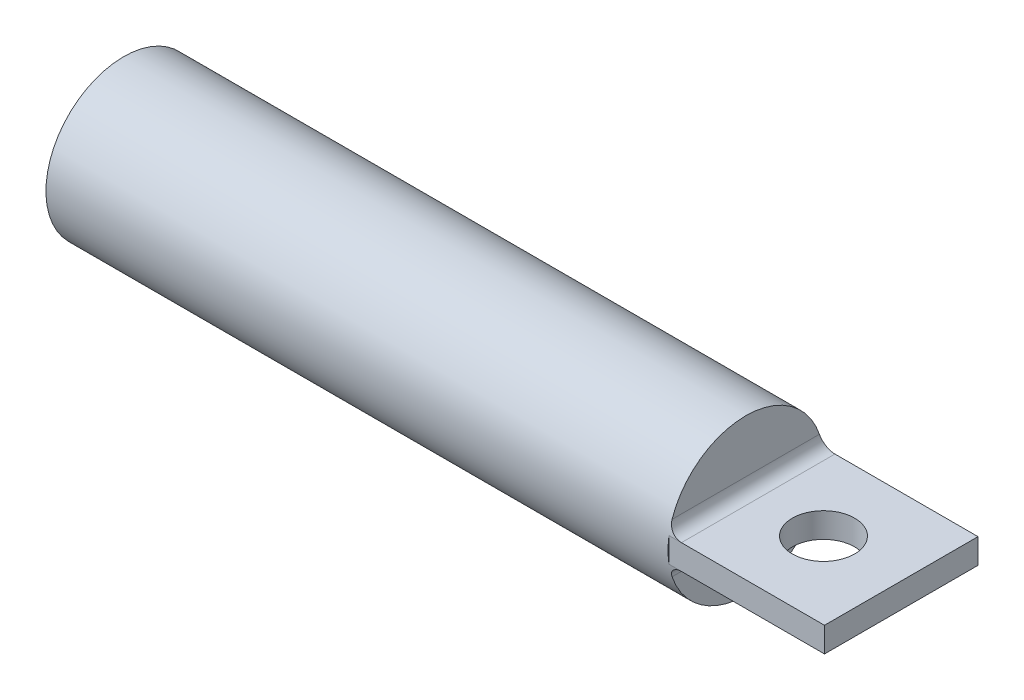
ISO-10303-21;
HEADER;
FILE_DESCRIPTION(('STEP AP214'),'2;1');
FILE_NAME('part.step','',(''),(''),'','','');
FILE_SCHEMA(('AUTOMOTIVE_DESIGN { 1 0 10303 214 1 1 1 1 }'));
ENDSEC;
DATA;
#1=APPLICATION_CONTEXT('core data for automotive mechanical design processes');
#2=APPLICATION_PROTOCOL_DEFINITION('international standard','automotive_design',2000,#1);
#3=PRODUCT_CONTEXT('',#1,'mechanical');
#4=PRODUCT('Part','Part','',(#3));
#5=PRODUCT_RELATED_PRODUCT_CATEGORY('part','',(#4));
#6=PRODUCT_DEFINITION_FORMATION('','',#4);
#7=PRODUCT_DEFINITION_CONTEXT('part definition',#1,'design');
#8=PRODUCT_DEFINITION('design','',#6,#7);
#9=PRODUCT_DEFINITION_SHAPE('','',#8);
#10=(LENGTH_UNIT() NAMED_UNIT(*) SI_UNIT(.MILLI.,.METRE.));
#11=(NAMED_UNIT(*) PLANE_ANGLE_UNIT() SI_UNIT($,.RADIAN.));
#12=(NAMED_UNIT(*) SI_UNIT($,.STERADIAN.) SOLID_ANGLE_UNIT());
#13=UNCERTAINTY_MEASURE_WITH_UNIT(LENGTH_MEASURE(1.E-05),#10,'distance_accuracy_value','');
#14=(GEOMETRIC_REPRESENTATION_CONTEXT(3) GLOBAL_UNCERTAINTY_ASSIGNED_CONTEXT((#13)) GLOBAL_UNIT_ASSIGNED_CONTEXT((#10,
#11,#12)) REPRESENTATION_CONTEXT('',''));
#15=CARTESIAN_POINT('',(0.,0.,0.));
#16=DIRECTION('',(0.,0.,1.));
#17=DIRECTION('',(1.,0.,0.));
#18=AXIS2_PLACEMENT_3D('',#15,#16,#17);
#19=CARTESIAN_POINT('',(25.4,0.,0.));
#20=DIRECTION('',(1.,0.,0.));
#21=DIRECTION('',(0.,0.,-1.));
#22=AXIS2_PLACEMENT_3D('',#19,#20,#21);
#23=PLANE('',#22);
#24=DIRECTION('',(0.,-1.,0.));
#25=VECTOR('',#24,1.);
#26=CARTESIAN_POINT('',(25.4,-0.508,3.13409652053028));
#27=LINE('',#26,#25);
#28=CARTESIAN_POINT('',(25.4,0.508,3.13409652053028));
#29=VERTEX_POINT('',#28);
#30=CARTESIAN_POINT('',(25.4,-0.508,3.13409652053028));
#31=VERTEX_POINT('',#30);
#32=EDGE_CURVE('E206',#29,#31,#27,.T.);
#33=ORIENTED_EDGE('',*,*,#32,.F.);
#34=CARTESIAN_POINT('',(25.4,0.,0.));
#35=DIRECTION('',(1.,0.,0.));
#36=DIRECTION('',(0.,0.,-1.));
#37=AXIS2_PLACEMENT_3D('',#34,#35,#36);
#38=CIRCLE('',#37,3.175);
#39=EDGE_CURVE('E139',#29,#31,#38,.T.);
#40=ORIENTED_EDGE('',*,*,#39,.T.);
#41=EDGE_LOOP('',(#33,#40));
#42=FACE_BOUND('',#41,.T.);
#43=ADVANCED_FACE('F32',(#42),#23,.T.);
#44=CARTESIAN_POINT('',(25.4,1.016,-3.00805069771106));
#45=VERTEX_POINT('',#44);
#46=CARTESIAN_POINT('',(25.4,1.016,3.00805069771106));
#47=VERTEX_POINT('',#46);
#48=EDGE_CURVE('E140',#45,#47,#38,.T.);
#49=ORIENTED_EDGE('',*,*,#48,.T.);
#50=DIRECTION('',(0.,0.,1.));
#51=VECTOR('',#50,1.);
#52=CARTESIAN_POINT('',(25.4,1.016,0.));
#53=LINE('',#52,#51);
#54=EDGE_CURVE('E144',#47,#45,#53,.F.);
#55=ORIENTED_EDGE('',*,*,#54,.T.);
#56=EDGE_LOOP('',(#49,#55));
#57=FACE_BOUND('',#56,.T.);
#58=ADVANCED_FACE('F177',(#57),#23,.T.);
#59=DIRECTION('',(0.,1.,0.));
#60=VECTOR('',#59,1.);
#61=CARTESIAN_POINT('',(25.4,0.508,-3.13409652053028));
#62=LINE('',#61,#60);
#63=CARTESIAN_POINT('',(25.4,-0.508,-3.13409652053028));
#64=VERTEX_POINT('',#63);
#65=CARTESIAN_POINT('',(25.4,0.507999999999998,-3.13409652053028));
#66=VERTEX_POINT('',#65);
#67=EDGE_CURVE('E125',#64,#66,#62,.T.);
#68=ORIENTED_EDGE('',*,*,#67,.F.);
#69=EDGE_CURVE('E132',#64,#66,#38,.T.);
#70=ORIENTED_EDGE('',*,*,#69,.T.);
#71=EDGE_LOOP('',(#68,#70));
#72=FACE_BOUND('',#71,.T.);
#73=ADVANCED_FACE('F184',(#72),#23,.T.);
#74=CARTESIAN_POINT('',(25.4,0.,0.));
#75=DIRECTION('',(-1.,0.,0.));
#76=DIRECTION('',(0.,0.,1.));
#77=AXIS2_PLACEMENT_3D('',#74,#75,#76);
#78=CYLINDRICAL_SURFACE('',#77,3.175);
#79=ORIENTED_EDGE('',*,*,#48,.F.);
#80=CARTESIAN_POINT('',(25.4,1.016,-3.00805069771106));
#81=CARTESIAN_POINT('',(25.3999744032918,0.987517611628772,-3.01768849137824));
#82=CARTESIAN_POINT('',(25.4023951827937,0.958870654897861,-3.02689635971706));
#83=CARTESIAN_POINT('',(25.4121086085714,0.902069906468568,-3.04429793559751));
#84=CARTESIAN_POINT('',(25.4194061484062,0.873916639310065,-3.05249061465447));
#85=CARTESIAN_POINT('',(25.4388700534012,0.818935702852947,-3.06770145579501));
#86=CARTESIAN_POINT('',(25.451045353065,0.79211056813882,-3.07471742888801));
#87=CARTESIAN_POINT('',(25.4800040907193,0.740771694786242,-3.08748769418232));
#88=CARTESIAN_POINT('',(25.496783308182,0.716255866665418,-3.09324313329916));
#89=CARTESIAN_POINT('',(25.5338505431638,0.671184534607392,-3.10332928018853));
#90=CARTESIAN_POINT('',(25.5539945215507,0.650520127676837,-3.10770295057255));
#91=CARTESIAN_POINT('',(25.5976203458093,0.612813237566845,-3.11535809755968));
#92=CARTESIAN_POINT('',(25.6211030635868,0.595771703403957,-3.11863928811333));
#93=CARTESIAN_POINT('',(25.6701275331566,0.566243525622576,-3.1241341891762));
#94=CARTESIAN_POINT('',(25.6956082947026,0.553659687550104,-3.12637106778662));
#95=CARTESIAN_POINT('',(25.7483556405558,0.532906460484515,-3.12997563122692));
#96=CARTESIAN_POINT('',(25.7756208449149,0.524733704496133,-3.13134397915031));
#97=CARTESIAN_POINT('',(25.8205672120332,0.51527134744563,-3.1329113598045));
#98=CARTESIAN_POINT('',(25.8379510098739,0.512546160833053,-3.13335716841764));
#99=CARTESIAN_POINT('',(25.872886148487,0.508911026280369,-3.13394889056829));
#100=CARTESIAN_POINT('',(25.890437200448,0.507998374918635,-3.13409525074719));
#101=CARTESIAN_POINT('',(25.9079965036789,0.508000000012032,-3.13409652052833));
#102=B_SPLINE_CURVE_WITH_KNOTS('',3,(#80,#81,#82,#83,#84,#85,#86,#87,#88,#89,#90,#91,#92,#93,
#94,#95,#96,#97,#98,#99,#100,#101),.UNSPECIFIED.,.F.,.F.,(4,2,2,2,2,2,2,2,2,2,4),(0.,
0.0901333124127537,0.180357204693476,0.270747119587447,0.361054447026895,0.448187978324593,
0.535344306323793,0.620462538288279,0.705515706975862,0.758231839271423,0.810869285492851),.UNSPECIFIED.);
#103=CARTESIAN_POINT('',(25.908,0.508,-3.13409652053028));
#104=VERTEX_POINT('',#103);
#105=EDGE_CURVE('E155',#45,#104,#102,.T.);
#106=ORIENTED_EDGE('',*,*,#105,.T.);
#107=DIRECTION('',(-1.,0.,0.));
#108=VECTOR('',#107,1.);
#109=CARTESIAN_POINT('',(25.4,0.507999999999998,-3.13409652053028));
#110=LINE('',#109,#108);
#111=EDGE_CURVE('E311',#66,#104,#110,.F.);
#112=ORIENTED_EDGE('',*,*,#111,.F.);
#113=ORIENTED_EDGE('',*,*,#69,.F.);
#114=DIRECTION('',(-1.,0.,0.));
#115=VECTOR('',#114,1.);
#116=CARTESIAN_POINT('',(25.4,-0.508,-3.13409652053028));
#117=LINE('',#116,#115);
#118=CARTESIAN_POINT('',(25.9079965038714,-0.507999999999997,-3.13409652053028));
#119=VERTEX_POINT('',#118);
#120=EDGE_CURVE('E41',#64,#119,#117,.F.);
#121=ORIENTED_EDGE('',*,*,#120,.T.);
#122=CARTESIAN_POINT('',(25.9079965038714,-0.507999999999997,-3.13409652053028));
#123=CARTESIAN_POINT('',(25.8797717031895,-0.507974419566321,-3.13408980025937));
#124=CARTESIAN_POINT('',(25.8515542488646,-0.510351108507427,-3.13371525337494));
#125=CARTESIAN_POINT('',(25.7959428188716,-0.519719365469269,-3.13218091450152));
#126=CARTESIAN_POINT('',(25.7685481326827,-0.526706824508829,-3.13102182165288));
#127=CARTESIAN_POINT('',(25.7153252029894,-0.545112004671271,-3.12786820710254));
#128=CARTESIAN_POINT('',(25.6894977191587,-0.556531854791061,-3.12587328389234));
#129=CARTESIAN_POINT('',(25.6401560091234,-0.583434903581319,-3.12096398037492));
#130=CARTESIAN_POINT('',(25.6166414146108,-0.598917453856238,-3.11804974677207));
#131=CARTESIAN_POINT('',(25.5725477431488,-0.633480039027652,-3.11121155909454));
#132=CARTESIAN_POINT('',(25.551972118195,-0.652564244222185,-3.10728643258269));
#133=CARTESIAN_POINT('',(25.5143352918812,-0.693712035454519,-3.09835939832883));
#134=CARTESIAN_POINT('',(25.4972742375737,-0.715775746093362,-3.09335744554942));
#135=CARTESIAN_POINT('',(25.466936307634,-0.762409485170083,-3.08219665575005));
#136=CARTESIAN_POINT('',(25.4536969339139,-0.787001338703983,-3.07602727653712));
#137=CARTESIAN_POINT('',(25.4314867910381,-0.837767692007906,-3.06259028762071));
#138=CARTESIAN_POINT('',(25.4225167622564,-0.863942465395648,-3.0553224877209));
#139=CARTESIAN_POINT('',(25.4104741285285,-0.911180084112772,-3.04151916363413));
#140=CARTESIAN_POINT('',(25.4065336136515,-0.932085184616533,-3.03518025462755));
#141=CARTESIAN_POINT('',(25.4012966085683,-0.974019233664649,-3.02198623818588));
#142=CARTESIAN_POINT('',(25.3999950531123,-0.995047867103927,-3.0151321458875));
#143=CARTESIAN_POINT('',(25.4,-1.016,-3.00805069771106));
#144=B_SPLINE_CURVE_WITH_KNOTS('',3,(#122,#123,#124,#125,#126,#127,#128,#129,#130,#131,#132,
#133,#134,#135,#136,#137,#138,#139,#140,#141,#142,#143),.UNSPECIFIED.,.F.,.F.,(4,2,2,2,2,2,2,2,
2,2,4),(0.,0.0845615157500869,0.169047774383328,0.253574664364937,0.338088072288241,
0.42269994406877,0.507315355360927,0.592734869570084,0.678169191522528,0.744603086856162,
0.810909347015586),.UNSPECIFIED.);
#145=CARTESIAN_POINT('',(25.4,-1.016,-3.00805069771106));
#146=VERTEX_POINT('',#145);
#147=EDGE_CURVE('E70',#119,#146,#144,.T.);
#148=ORIENTED_EDGE('',*,*,#147,.T.);
#149=CARTESIAN_POINT('',(25.4,-1.016,3.00805069771106));
#150=VERTEX_POINT('',#149);
#151=EDGE_CURVE('E137',#150,#146,#38,.T.);
#152=ORIENTED_EDGE('',*,*,#151,.F.);
#153=CARTESIAN_POINT('',(25.4,-1.016,3.00805069771106));
#154=CARTESIAN_POINT('',(25.3999744032918,-0.98751761162877,3.01768849137824));
#155=CARTESIAN_POINT('',(25.4023951827937,-0.958870654897857,3.02689635971706));
#156=CARTESIAN_POINT('',(25.4121086085714,-0.902069906468563,3.04429793559751));
#157=CARTESIAN_POINT('',(25.4194061484062,-0.873916639310063,3.05249061465447));
#158=CARTESIAN_POINT('',(25.4388700534012,-0.81893570285295,3.06770145579501));
#159=CARTESIAN_POINT('',(25.451045353065,-0.792110568138828,3.07471742888801));
#160=CARTESIAN_POINT('',(25.4800040907193,-0.740771694786249,3.08748769418231));
#161=CARTESIAN_POINT('',(25.496783308182,-0.716255866665422,3.09324313329916));
#162=CARTESIAN_POINT('',(25.5338505431638,-0.671184534607383,3.10332928018854));
#163=CARTESIAN_POINT('',(25.5539945215507,-0.65052012767682,3.10770295057255));
#164=CARTESIAN_POINT('',(25.5976203458094,-0.612813237566831,3.11535809755969));
#165=CARTESIAN_POINT('',(25.6211030635868,-0.59577170340395,3.11863928811333));
#166=CARTESIAN_POINT('',(25.6701275331566,-0.566243525622597,3.12413418917619));
#167=CARTESIAN_POINT('',(25.6956082947025,-0.553659687550139,3.12637106778661));
#168=CARTESIAN_POINT('',(25.7483556405557,-0.53290646048454,3.12997563122691));
#169=CARTESIAN_POINT('',(25.7756208449149,-0.524733704496144,3.13134397915031));
#170=CARTESIAN_POINT('',(25.8205672120651,-0.515271347438938,3.13291135980561));
#171=CARTESIAN_POINT('',(25.8379510099382,-0.512546160822976,3.13335716841929));
#172=CARTESIAN_POINT('',(25.8728861486167,-0.508911026270254,3.13394889056993));
#173=CARTESIAN_POINT('',(25.8904372006106,-0.507998374911863,3.13409525074828));
#174=CARTESIAN_POINT('',(25.907996503874,-0.50800000001203,3.13409652052833));
#175=B_SPLINE_CURVE_WITH_KNOTS('',3,(#153,#154,#155,#156,#157,#158,#159,#160,#161,#162,#163,
#164,#165,#166,#167,#168,#169,#170,#171,#172,#173,#174),.UNSPECIFIED.,.F.,.F.,(4,2,2,2,2,2,2,2,
2,2,4),(0.,0.0901333124127614,0.180357204693476,0.270747119587433,0.361054447026895,
0.448187978324629,0.535344306323793,0.620462538288155,0.705515706975862,0.758231839368831,
0.810869285687713),.UNSPECIFIED.);
#176=CARTESIAN_POINT('',(25.908,-0.508,3.13409652053028));
#177=VERTEX_POINT('',#176);
#178=EDGE_CURVE('E318',#150,#177,#175,.T.);
#179=ORIENTED_EDGE('',*,*,#178,.T.);
#180=DIRECTION('',(-1.,0.,0.));
#181=VECTOR('',#180,1.);
#182=CARTESIAN_POINT('',(25.4,-0.508,3.13409652053028));
#183=LINE('',#182,#181);
#184=EDGE_CURVE('E11',#31,#177,#183,.F.);
#185=ORIENTED_EDGE('',*,*,#184,.F.);
#186=ORIENTED_EDGE('',*,*,#39,.F.);
#187=DIRECTION('',(-1.,0.,0.));
#188=VECTOR('',#187,1.);
#189=CARTESIAN_POINT('',(25.4,0.508,3.13409652053028));
#190=LINE('',#189,#188);
#191=CARTESIAN_POINT('',(25.9079965038714,0.507999999999997,3.13409652053028));
#192=VERTEX_POINT('',#191);
#193=EDGE_CURVE('E315',#29,#192,#190,.F.);
#194=ORIENTED_EDGE('',*,*,#193,.T.);
#195=CARTESIAN_POINT('',(25.9079965038714,0.507999999999997,3.13409652053028));
#196=CARTESIAN_POINT('',(25.8797717031895,0.507974419566321,3.13408980025937));
#197=CARTESIAN_POINT('',(25.8515542488646,0.510351108507427,3.13371525337494));
#198=CARTESIAN_POINT('',(25.7959428188716,0.519719365469269,3.13218091450152));
#199=CARTESIAN_POINT('',(25.7685481326827,0.526706824508829,3.13102182165288));
#200=CARTESIAN_POINT('',(25.7153252029894,0.545112004671271,3.12786820710254));
#201=CARTESIAN_POINT('',(25.6894977191587,0.556531854791061,3.12587328389234));
#202=CARTESIAN_POINT('',(25.6401560091234,0.583434903581319,3.12096398037492));
#203=CARTESIAN_POINT('',(25.6166414146108,0.598917453856238,3.11804974677207));
#204=CARTESIAN_POINT('',(25.5725477431488,0.633480039027652,3.11121155909454));
#205=CARTESIAN_POINT('',(25.551972118195,0.652564244222185,3.10728643258269));
#206=CARTESIAN_POINT('',(25.5143352918812,0.693712035454519,3.09835939832883));
#207=CARTESIAN_POINT('',(25.4972742375737,0.715775746093362,3.09335744554942));
#208=CARTESIAN_POINT('',(25.466936307634,0.762409485170083,3.08219665575005));
#209=CARTESIAN_POINT('',(25.4536969339139,0.787001338703983,3.07602727653712));
#210=CARTESIAN_POINT('',(25.4314867910381,0.837767692007906,3.06259028762071));
#211=CARTESIAN_POINT('',(25.4225167622564,0.863942465395648,3.0553224877209));
#212=CARTESIAN_POINT('',(25.4104741285285,0.911180084112772,3.04151916363413));
#213=CARTESIAN_POINT('',(25.4065336136515,0.932085184616533,3.03518025462755));
#214=CARTESIAN_POINT('',(25.4012966085683,0.974019233664649,3.02198623818588));
#215=CARTESIAN_POINT('',(25.3999950531123,0.995047867103927,3.0151321458875));
#216=CARTESIAN_POINT('',(25.4,1.016,3.00805069771106));
#217=B_SPLINE_CURVE_WITH_KNOTS('',3,(#195,#196,#197,#198,#199,#200,#201,#202,#203,#204,#205,
#206,#207,#208,#209,#210,#211,#212,#213,#214,#215,#216),.UNSPECIFIED.,.F.,.F.,(4,2,2,2,2,2,2,2,
2,2,4),(0.,0.0845615157500869,0.169047774383328,0.253574664364937,0.338088072288241,
0.42269994406877,0.507315355360927,0.592734869570084,0.678169191522528,0.744603086856162,
0.810909347015586),.UNSPECIFIED.);
#218=EDGE_CURVE('E81',#192,#47,#217,.T.);
#219=ORIENTED_EDGE('',*,*,#218,.T.);
#220=EDGE_LOOP('',(#79,#106,#112,#113,#121,#148,#152,#179,#185,#186,#194,#219));
#221=FACE_BOUND('',#220,.T.);
#222=CARTESIAN_POINT('',(0.,0.,0.));
#223=DIRECTION('',(1.,0.,0.));
#224=DIRECTION('',(0.,0.,-1.));
#225=AXIS2_PLACEMENT_3D('',#222,#223,#224);
#226=CIRCLE('',#225,3.175);
#227=CARTESIAN_POINT('',(0.,0.,-3.175));
#228=VERTEX_POINT('',#227);
#229=EDGE_CURVE('E129',#228,#228,#226,.T.);
#230=ORIENTED_EDGE('',*,*,#229,.T.);
#231=EDGE_LOOP('',(#230));
#232=FACE_BOUND('',#231,.T.);
#233=ADVANCED_FACE('F160',(#221,#232),#78,.T.);
#234=ORIENTED_EDGE('',*,*,#151,.T.);
#235=DIRECTION('',(0.,0.,-1.));
#236=VECTOR('',#235,1.);
#237=CARTESIAN_POINT('',(25.4,-1.016,0.));
#238=LINE('',#237,#236);
#239=EDGE_CURVE('E148',#146,#150,#238,.F.);
#240=ORIENTED_EDGE('',*,*,#239,.T.);
#241=EDGE_LOOP('',(#234,#240));
#242=FACE_BOUND('',#241,.T.);
#243=ADVANCED_FACE('F180',(#242),#23,.T.);
#244=CARTESIAN_POINT('',(0.,0.,0.));
#245=DIRECTION('',(1.,0.,0.));
#246=DIRECTION('',(0.,0.,-1.));
#247=AXIS2_PLACEMENT_3D('',#244,#245,#246);
#248=PLANE('',#247);
#249=ORIENTED_EDGE('',*,*,#229,.F.);
#250=EDGE_LOOP('',(#249));
#251=FACE_BOUND('',#250,.T.);
#252=ADVANCED_FACE('F189',(#251),#248,.F.);
#253=CARTESIAN_POINT('',(31.75,-0.508,3.13409652053028));
#254=DIRECTION('',(0.,0.,-1.));
#255=DIRECTION('',(-1.,0.,0.));
#256=AXIS2_PLACEMENT_3D('',#253,#254,#255);
#257=PLANE('',#256);
#258=ORIENTED_EDGE('',*,*,#32,.T.);
#259=ORIENTED_EDGE('',*,*,#184,.T.);
#260=DIRECTION('',(-1.,0.,0.));
#261=VECTOR('',#260,1.);
#262=CARTESIAN_POINT('',(31.75,-0.508,3.13409652053028));
#263=LINE('',#262,#261);
#264=CARTESIAN_POINT('',(31.75,-0.508,3.13409652053028));
#265=VERTEX_POINT('',#264);
#266=EDGE_CURVE('E48',#265,#177,#263,.T.);
#267=ORIENTED_EDGE('',*,*,#266,.F.);
#268=DIRECTION('',(0.,-1.,0.));
#269=VECTOR('',#268,1.);
#270=CARTESIAN_POINT('',(31.75,-0.508,3.13409652053028));
#271=LINE('',#270,#269);
#272=CARTESIAN_POINT('',(31.75,0.508,3.13409652053028));
#273=VERTEX_POINT('',#272);
#274=EDGE_CURVE('E117',#273,#265,#271,.T.);
#275=ORIENTED_EDGE('',*,*,#274,.F.);
#276=DIRECTION('',(-1.,0.,0.));
#277=VECTOR('',#276,1.);
#278=CARTESIAN_POINT('',(31.75,0.508,3.13409652053028));
#279=LINE('',#278,#277);
#280=EDGE_CURVE('E212',#273,#192,#279,.T.);
#281=ORIENTED_EDGE('',*,*,#280,.T.);
#282=ORIENTED_EDGE('',*,*,#193,.F.);
#283=EDGE_LOOP('',(#258,#259,#267,#275,#281,#282));
#284=FACE_BOUND('',#283,.T.);
#285=ADVANCED_FACE('F128',(#284),#257,.F.);
#286=CARTESIAN_POINT('',(31.75,-0.508,-3.13409652053028));
#287=DIRECTION('',(0.,1.,0.));
#288=DIRECTION('',(0.,0.,1.));
#289=AXIS2_PLACEMENT_3D('',#286,#287,#288);
#290=PLANE('',#289);
#291=CARTESIAN_POINT('',(28.575,-0.508,0.));
#292=DIRECTION('',(0.,1.,0.));
#293=DIRECTION('',(0.,0.,1.));
#294=AXIS2_PLACEMENT_3D('',#291,#292,#293);
#295=CIRCLE('',#294,1.27);
#296=CARTESIAN_POINT('',(28.575,-0.508,1.27));
#297=VERTEX_POINT('',#296);
#298=EDGE_CURVE('E208',#297,#297,#295,.T.);
#299=ORIENTED_EDGE('',*,*,#298,.T.);
#300=EDGE_LOOP('',(#299));
#301=FACE_BOUND('',#300,.T.);
#302=ORIENTED_EDGE('',*,*,#266,.T.);
#303=DIRECTION('',(0.,0.,-1.));
#304=VECTOR('',#303,1.);
#305=CARTESIAN_POINT('',(25.908,-0.508,-3.13409652053028));
#306=LINE('',#305,#304);
#307=EDGE_CURVE('E146',#177,#119,#306,.T.);
#308=ORIENTED_EDGE('',*,*,#307,.T.);
#309=DIRECTION('',(-1.,0.,0.));
#310=VECTOR('',#309,1.);
#311=CARTESIAN_POINT('',(31.75,-0.508,-3.13409652053028));
#312=LINE('',#311,#310);
#313=CARTESIAN_POINT('',(31.75,-0.508,-3.13409652053028));
#314=VERTEX_POINT('',#313);
#315=EDGE_CURVE('E113',#314,#119,#312,.T.);
#316=ORIENTED_EDGE('',*,*,#315,.F.);
#317=DIRECTION('',(0.,0.,-1.));
#318=VECTOR('',#317,1.);
#319=CARTESIAN_POINT('',(31.75,-0.508,-3.13409652053028));
#320=LINE('',#319,#318);
#321=EDGE_CURVE('E109',#265,#314,#320,.T.);
#322=ORIENTED_EDGE('',*,*,#321,.F.);
#323=EDGE_LOOP('',(#302,#308,#316,#322));
#324=FACE_BOUND('',#323,.T.);
#325=ADVANCED_FACE('F111',(#301,#324),#290,.F.);
#326=CARTESIAN_POINT('',(31.75,0.508,-3.13409652053028));
#327=DIRECTION('',(0.,0.,1.));
#328=DIRECTION('',(1.,0.,0.));
#329=AXIS2_PLACEMENT_3D('',#326,#327,#328);
#330=PLANE('',#329);
#331=ORIENTED_EDGE('',*,*,#67,.T.);
#332=ORIENTED_EDGE('',*,*,#111,.T.);
#333=DIRECTION('',(-1.,0.,0.));
#334=VECTOR('',#333,1.);
#335=CARTESIAN_POINT('',(31.75,0.508,-3.13409652053028));
#336=LINE('',#335,#334);
#337=CARTESIAN_POINT('',(31.75,0.508,-3.13409652053028));
#338=VERTEX_POINT('',#337);
#339=EDGE_CURVE('E57',#338,#104,#336,.T.);
#340=ORIENTED_EDGE('',*,*,#339,.F.);
#341=DIRECTION('',(0.,1.,0.));
#342=VECTOR('',#341,1.);
#343=CARTESIAN_POINT('',(31.75,0.508,-3.13409652053028));
#344=LINE('',#343,#342);
#345=EDGE_CURVE('E116',#314,#338,#344,.T.);
#346=ORIENTED_EDGE('',*,*,#345,.F.);
#347=ORIENTED_EDGE('',*,*,#315,.T.);
#348=ORIENTED_EDGE('',*,*,#120,.F.);
#349=EDGE_LOOP('',(#331,#332,#340,#346,#347,#348));
#350=FACE_BOUND('',#349,.T.);
#351=ADVANCED_FACE('F224',(#350),#330,.F.);
#352=CARTESIAN_POINT('',(31.75,0.508,3.13409652053028));
#353=DIRECTION('',(0.,-1.,0.));
#354=DIRECTION('',(0.,0.,-1.));
#355=AXIS2_PLACEMENT_3D('',#352,#353,#354);
#356=PLANE('',#355);
#357=CARTESIAN_POINT('',(28.575,0.508,0.));
#358=DIRECTION('',(0.,1.,0.));
#359=DIRECTION('',(0.,0.,1.));
#360=AXIS2_PLACEMENT_3D('',#357,#358,#359);
#361=CIRCLE('',#360,1.27);
#362=CARTESIAN_POINT('',(28.575,0.508,1.27));
#363=VERTEX_POINT('',#362);
#364=EDGE_CURVE('E217',#363,#363,#361,.T.);
#365=ORIENTED_EDGE('',*,*,#364,.F.);
#366=EDGE_LOOP('',(#365));
#367=FACE_BOUND('',#366,.T.);
#368=ORIENTED_EDGE('',*,*,#339,.T.);
#369=DIRECTION('',(0.,0.,1.));
#370=VECTOR('',#369,1.);
#371=CARTESIAN_POINT('',(25.908,0.508,3.13409652053028));
#372=LINE('',#371,#370);
#373=EDGE_CURVE('E142',#104,#192,#372,.T.);
#374=ORIENTED_EDGE('',*,*,#373,.T.);
#375=ORIENTED_EDGE('',*,*,#280,.F.);
#376=DIRECTION('',(0.,0.,1.));
#377=VECTOR('',#376,1.);
#378=CARTESIAN_POINT('',(31.75,0.508,3.13409652053028));
#379=LINE('',#378,#377);
#380=EDGE_CURVE('E121',#338,#273,#379,.T.);
#381=ORIENTED_EDGE('',*,*,#380,.F.);
#382=EDGE_LOOP('',(#368,#374,#375,#381));
#383=FACE_BOUND('',#382,.T.);
#384=ADVANCED_FACE('F222',(#367,#383),#356,.F.);
#385=CARTESIAN_POINT('',(31.75,0.,0.));
#386=DIRECTION('',(-1.,0.,0.));
#387=DIRECTION('',(0.,0.,1.));
#388=AXIS2_PLACEMENT_3D('',#385,#386,#387);
#389=PLANE('',#388);
#390=ORIENTED_EDGE('',*,*,#274,.T.);
#391=ORIENTED_EDGE('',*,*,#321,.T.);
#392=ORIENTED_EDGE('',*,*,#345,.T.);
#393=ORIENTED_EDGE('',*,*,#380,.T.);
#394=EDGE_LOOP('',(#390,#391,#392,#393));
#395=FACE_BOUND('',#394,.T.);
#396=ADVANCED_FACE('F120',(#395),#389,.F.);
#397=CARTESIAN_POINT('',(28.575,-3.175,0.));
#398=DIRECTION('',(0.,1.,0.));
#399=DIRECTION('',(0.,0.,1.));
#400=AXIS2_PLACEMENT_3D('',#397,#398,#399);
#401=CYLINDRICAL_SURFACE('',#400,1.27);
#402=ORIENTED_EDGE('',*,*,#364,.T.);
#403=EDGE_LOOP('',(#402));
#404=FACE_BOUND('',#403,.T.);
#405=ORIENTED_EDGE('',*,*,#298,.F.);
#406=EDGE_LOOP('',(#405));
#407=FACE_BOUND('',#406,.T.);
#408=ADVANCED_FACE('F166',(#404,#407),#401,.F.);
#409=CARTESIAN_POINT('',(25.908,1.016,3.13409652053028));
#410=DIRECTION('',(0.,0.,1.));
#411=DIRECTION('',(1.,0.,0.));
#412=AXIS2_PLACEMENT_3D('',#409,#410,#411);
#413=CYLINDRICAL_SURFACE('',#412,0.508);
#414=ORIENTED_EDGE('',*,*,#105,.F.);
#415=ORIENTED_EDGE('',*,*,#54,.F.);
#416=ORIENTED_EDGE('',*,*,#218,.F.);
#417=ORIENTED_EDGE('',*,*,#373,.F.);
#418=EDGE_LOOP('',(#414,#415,#416,#417));
#419=FACE_BOUND('',#418,.T.);
#420=ADVANCED_FACE('F163',(#419),#413,.F.);
#421=CARTESIAN_POINT('',(25.908,-1.016,-3.13409652053028));
#422=DIRECTION('',(0.,0.,-1.));
#423=DIRECTION('',(-1.,0.,0.));
#424=AXIS2_PLACEMENT_3D('',#421,#422,#423);
#425=CYLINDRICAL_SURFACE('',#424,0.508);
#426=ORIENTED_EDGE('',*,*,#178,.F.);
#427=ORIENTED_EDGE('',*,*,#239,.F.);
#428=ORIENTED_EDGE('',*,*,#147,.F.);
#429=ORIENTED_EDGE('',*,*,#307,.F.);
#430=EDGE_LOOP('',(#426,#427,#428,#429));
#431=FACE_BOUND('',#430,.T.);
#432=ADVANCED_FACE('F34',(#431),#425,.F.);
#433=CLOSED_SHELL('',(#43,#58,#73,#233,#243,#252,#285,#325,#351,#384,#396,#408,#420,#432));
#434=MANIFOLD_SOLID_BREP('B2',#433);
#435=ADVANCED_BREP_SHAPE_REPRESENTATION('',(#18,#434),#14);
#436=SHAPE_DEFINITION_REPRESENTATION(#9,#435);
ENDSEC;
END-ISO-10303-21;
